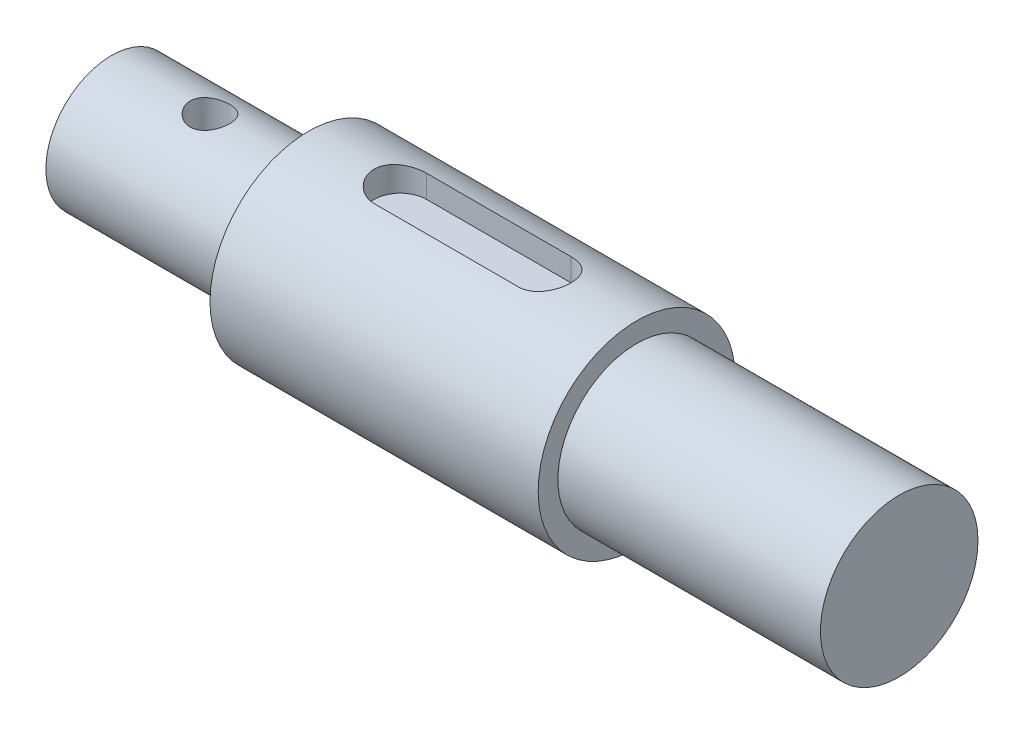
ISO-10303-21;
HEADER;
FILE_DESCRIPTION(('STEP AP214'),'2;1');
FILE_NAME('part.step','',(''),(''),'','','');
FILE_SCHEMA(('AUTOMOTIVE_DESIGN { 1 0 10303 214 1 1 1 1 }'));
ENDSEC;
DATA;
#1=APPLICATION_CONTEXT('core data for automotive mechanical design processes');
#2=APPLICATION_PROTOCOL_DEFINITION('international standard','automotive_design',2000,#1);
#3=PRODUCT_CONTEXT('',#1,'mechanical');
#4=PRODUCT('Part','Part','',(#3));
#5=PRODUCT_RELATED_PRODUCT_CATEGORY('part','',(#4));
#6=PRODUCT_DEFINITION_FORMATION('','',#4);
#7=PRODUCT_DEFINITION_CONTEXT('part definition',#1,'design');
#8=PRODUCT_DEFINITION('design','',#6,#7);
#9=PRODUCT_DEFINITION_SHAPE('','',#8);
#10=(LENGTH_UNIT() NAMED_UNIT(*) SI_UNIT(.MILLI.,.METRE.));
#11=(NAMED_UNIT(*) PLANE_ANGLE_UNIT() SI_UNIT($,.RADIAN.));
#12=(NAMED_UNIT(*) SI_UNIT($,.STERADIAN.) SOLID_ANGLE_UNIT());
#13=UNCERTAINTY_MEASURE_WITH_UNIT(LENGTH_MEASURE(1.E-05),#10,'distance_accuracy_value','');
#14=(GEOMETRIC_REPRESENTATION_CONTEXT(3) GLOBAL_UNCERTAINTY_ASSIGNED_CONTEXT((#13)) GLOBAL_UNIT_ASSIGNED_CONTEXT((#10,
#11,#12)) REPRESENTATION_CONTEXT('',''));
#15=CARTESIAN_POINT('',(0.,0.,0.));
#16=DIRECTION('',(0.,0.,1.));
#17=DIRECTION('',(1.,0.,0.));
#18=AXIS2_PLACEMENT_3D('',#15,#16,#17);
#19=CARTESIAN_POINT('',(30.,0.,0.));
#20=DIRECTION('',(-1.,0.,0.));
#21=DIRECTION('',(0.,0.,1.));
#22=AXIS2_PLACEMENT_3D('',#19,#20,#21);
#23=CYLINDRICAL_SURFACE('',#22,10.);
#24=CARTESIAN_POINT('',(15.,-9.53939201416946,3.));
#25=CARTESIAN_POINT('',(15.1643890958848,-9.5393937145396,2.99999795267528));
#26=CARTESIAN_POINT('',(15.328798448288,-9.54368780418137,2.98644216334284));
#27=CARTESIAN_POINT('',(15.6528104991839,-9.56033156605799,2.93271688893498));
#28=CARTESIAN_POINT('',(15.8124115730029,-9.57268392986936,2.89253851147156));
#29=CARTESIAN_POINT('',(16.1220694565435,-9.60392204971265,2.78705506539911));
#30=CARTESIAN_POINT('',(16.2721416592662,-9.62279693406465,2.72179178788487));
#31=CARTESIAN_POINT('',(16.5592438679906,-9.66493865095134,2.56812843835858));
#32=CARTESIAN_POINT('',(16.6962719173689,-9.68820614082039,2.47972490274105));
#33=CARTESIAN_POINT('',(16.9577327811547,-9.73733724371531,2.27929508283254));
#34=CARTESIAN_POINT('',(17.0816917958926,-9.76325616623271,2.16666414351613));
#35=CARTESIAN_POINT('',(17.309275902645,-9.81429723873514,1.9222724751592));
#36=CARTESIAN_POINT('',(17.4128983808998,-9.8394192859541,1.79050929092223));
#37=CARTESIAN_POINT('',(17.5989253996666,-9.88666429158777,1.50822287558738));
#38=CARTESIAN_POINT('',(17.6808468488856,-9.90871448684808,1.35736804267163));
#39=CARTESIAN_POINT('',(17.8179745180855,-9.94668871841369,1.04324929073871));
#40=CARTESIAN_POINT('',(17.8731864997149,-9.96261407578992,0.879988056775824));
#41=CARTESIAN_POINT('',(17.953760002181,-9.98615292007178,0.55064770526166));
#42=CARTESIAN_POINT('',(17.9799302553054,-9.99399114738673,0.384782797907604));
#43=CARTESIAN_POINT('',(18.0042346492929,-10.001264030027,0.0508436474986294));
#44=CARTESIAN_POINT('',(18.0023746788039,-10.0007004504217,-0.117230124100742));
#45=CARTESIAN_POINT('',(17.971214262914,-9.99139207635305,-0.445142313200313));
#46=CARTESIAN_POINT('',(17.9427896123803,-9.98290840410475,-0.605072535282659));
#47=CARTESIAN_POINT('',(17.8607373280114,-9.95903044225231,-0.917778426885074));
#48=CARTESIAN_POINT('',(17.8071080981145,-9.9436357150134,-1.07055364264577));
#49=CARTESIAN_POINT('',(17.675575953163,-9.90730441973756,-1.36669465270247));
#50=CARTESIAN_POINT('',(17.5973975943861,-9.88630539352772,-1.50993012938864));
#51=CARTESIAN_POINT('',(17.419204295143,-9.84099281296778,-1.78152934756663));
#52=CARTESIAN_POINT('',(17.3191841740708,-9.81667847277943,-1.90988954974544));
#53=CARTESIAN_POINT('',(17.0956044984991,-9.76623100973852,-2.15332096305837));
#54=CARTESIAN_POINT('',(16.9712861619492,-9.74006390633503,-2.26768916079755));
#55=CARTESIAN_POINT('',(16.7049799642112,-9.68967959784414,-2.47415303080114));
#56=CARTESIAN_POINT('',(16.562990349189,-9.66546258669242,-2.56624648967452));
#57=CARTESIAN_POINT('',(16.2635210615278,-9.62155806359712,-2.72627990669511));
#58=CARTESIAN_POINT('',(16.1059059083825,-9.60191621258491,-2.79397978469377));
#59=CARTESIAN_POINT('',(15.7807855832214,-9.5699278496379,-2.90166725750739));
#60=CARTESIAN_POINT('',(15.6132836569649,-9.55757895796639,-2.94166389279494));
#61=CARTESIAN_POINT('',(15.2798352784976,-9.54209699116239,-2.99149540565762));
#62=CARTESIAN_POINT('',(15.1140635522056,-9.53863757349918,-3.00239892760807));
#63=CARTESIAN_POINT('',(14.7830541999867,-9.54042384874813,-2.99671894465741));
#64=CARTESIAN_POINT('',(14.61781650254,-9.54566832310787,-2.98013928742559));
#65=CARTESIAN_POINT('',(14.2970232440566,-9.56395117112153,-2.92091527148479));
#66=CARTESIAN_POINT('',(14.1413276714725,-9.57678353015602,-2.87895922862587));
#67=CARTESIAN_POINT('',(13.8391966183706,-9.6085828246183,-2.77097155495853));
#68=CARTESIAN_POINT('',(13.692762571719,-9.62755070717977,-2.70493620685512));
#69=CARTESIAN_POINT('',(13.4089650718556,-9.67011670046268,-2.54863742393008));
#70=CARTESIAN_POINT('',(13.2719505580284,-9.69382542139644,-2.4577712834546));
#71=CARTESIAN_POINT('',(13.0147237876384,-9.74296411293928,-2.25510603200767));
#72=CARTESIAN_POINT('',(12.8945155647744,-9.76839449459994,-2.14330191069793));
#73=CARTESIAN_POINT('',(12.6696391883705,-9.81927267096329,-1.8969102649872));
#74=CARTESIAN_POINT('',(12.565728742026,-9.84468490126011,-1.76162213171487));
#75=CARTESIAN_POINT('',(12.3820665979445,-9.89169703497298,-1.4749235691805));
#76=CARTESIAN_POINT('',(12.3023137004371,-9.91329712769433,-1.32351394108789));
#77=CARTESIAN_POINT('',(12.1699999388634,-9.95011940949915,-1.00987100941044));
#78=CARTESIAN_POINT('',(12.1172359676821,-9.96538906849931,-0.847729244075679));
#79=CARTESIAN_POINT('',(12.0398781622192,-9.98803959193653,-0.516339933009177));
#80=CARTESIAN_POINT('',(12.0152762681032,-9.9954227134176,-0.347094434709527));
#81=CARTESIAN_POINT('',(11.995553911891,-10.001330881628,-0.0133043077654876));
#82=CARTESIAN_POINT('',(11.9993346091843,-10.0001861022264,0.151170358172411));
#83=CARTESIAN_POINT('',(12.0336432649982,-9.98994528930073,0.477038962328806));
#84=CARTESIAN_POINT('',(12.0641697069609,-9.98084970660925,0.638433074693055));
#85=CARTESIAN_POINT('',(12.1504233227993,-9.95582336716653,0.951871626082715));
#86=CARTESIAN_POINT('',(12.205876361298,-9.93996705801732,1.10399785470278));
#87=CARTESIAN_POINT('',(12.3401638290144,-9.903058860789,1.3968664755041));
#88=CARTESIAN_POINT('',(12.4190021005724,-9.88200611899893,1.53760699210116));
#89=CARTESIAN_POINT('',(12.6007469148601,-9.83607931656457,1.80860378484113));
#90=CARTESIAN_POINT('',(12.7043428600015,-9.81110453847119,1.93838050015353));
#91=CARTESIAN_POINT('',(12.9314207766656,-9.76047074424668,2.17907514269189));
#92=CARTESIAN_POINT('',(13.0549084757963,-9.73481153282158,2.28998761920387));
#93=CARTESIAN_POINT('',(13.322681556621,-9.68481361262638,2.49312538789097));
#94=CARTESIAN_POINT('',(13.4674771067809,-9.66053705386971,2.58469519515913));
#95=CARTESIAN_POINT('',(13.771110348322,-9.61705095017586,2.74208627057551));
#96=CARTESIAN_POINT('',(13.9299412472024,-9.59783897193911,2.80791991114577));
#97=CARTESIAN_POINT('',(14.2394808632125,-9.56855633435189,2.90603885065899));
#98=CARTESIAN_POINT('',(14.389217293862,-9.5577230968104,2.94117718022463));
#99=CARTESIAN_POINT('',(14.6926304449915,-9.54314085194333,2.98815637670288));
#100=CARTESIAN_POINT('',(14.8463063692905,-9.53939042442861,3.00000191412191));
#101=CARTESIAN_POINT('',(15.,-9.53939201416946,3.));
#102=B_SPLINE_CURVE_WITH_KNOTS('',3,(#24,#25,#26,#27,#28,#29,#30,#31,#32,#33,#34,#35,#36,#37,
#38,#39,#40,#41,#42,#43,#44,#45,#46,#47,#48,#49,#50,#51,#52,#53,#54,#55,#56,#57,#58,#59,#60,#61,
#62,#63,#64,#65,#66,#67,#68,#69,#70,#71,#72,#73,#74,#75,#76,#77,#78,#79,#80,#81,#82,#83,#84,#85,
#86,#87,#88,#89,#90,#91,#92,#93,#94,#95,#96,#97,#98,#99,#100,#101),.UNSPECIFIED.,.T.,.F.,(4,2,2,
2,2,2,2,2,2,2,2,2,2,2,2,2,2,2,2,2,2,2,2,2,2,2,2,2,2,2,2,2,2,2,2,2,2,2,4),(0.,0.492600331831084,
0.985365283377997,1.47731282893239,1.9693340507402,2.47546300015967,2.98165695742545,
3.49831878547288,4.01486911175754,4.51664280299115,5.0183110820288,5.5040025198176,
5.98972471780752,6.48110418671352,6.9726003318166,7.48304294046555,7.99353624983725,
8.50892476494933,9.02414501262032,9.52016161585828,10.0161087821998,10.4991718988284,
10.9823096209678,11.4784146362399,11.9746385186305,12.4895901220641,13.0045161465361,
13.5155078363386,14.0263532464857,14.5175260782765,15.0086710610072,15.4945419374965,
15.9804926898797,16.4819925411419,16.9836370526499,17.500232793435,18.016579879331,
18.477223077201,18.9377739007233),.UNSPECIFIED.);
#103=CARTESIAN_POINT('',(15.,-9.53939201416946,3.));
#104=VERTEX_POINT('',#103);
#105=EDGE_CURVE('E56',#104,#104,#102,.T.);
#106=ORIENTED_EDGE('',*,*,#105,.T.);
#107=EDGE_LOOP('',(#106));
#108=FACE_BOUND('',#107,.T.);
#109=CARTESIAN_POINT('',(15.,9.53939201416946,3.));
#110=CARTESIAN_POINT('',(14.8356109041152,9.5393937145396,2.99999795267528));
#111=CARTESIAN_POINT('',(14.671201551712,9.54368780418137,2.98644216334284));
#112=CARTESIAN_POINT('',(14.3471895008161,9.56033156605799,2.93271688893498));
#113=CARTESIAN_POINT('',(14.1875884269971,9.57268392986936,2.89253851147156));
#114=CARTESIAN_POINT('',(13.8779305434565,9.60392204971265,2.7870550653991));
#115=CARTESIAN_POINT('',(13.7278583407338,9.62279693406465,2.72179178788487));
#116=CARTESIAN_POINT('',(13.4407561320094,9.66493865095134,2.56812843835858));
#117=CARTESIAN_POINT('',(13.3037280826311,9.68820614082039,2.47972490274105));
#118=CARTESIAN_POINT('',(13.0422672188452,9.73733724371531,2.27929508283254));
#119=CARTESIAN_POINT('',(12.9183082041074,9.76325616623271,2.16666414351613));
#120=CARTESIAN_POINT('',(12.690724097355,9.81429723873514,1.9222724751592));
#121=CARTESIAN_POINT('',(12.5871016191002,9.8394192859541,1.79050929092222));
#122=CARTESIAN_POINT('',(12.4010746003334,9.88666429158777,1.50822287558738));
#123=CARTESIAN_POINT('',(12.3191531511144,9.90871448684808,1.35736804267163));
#124=CARTESIAN_POINT('',(12.1820254819145,9.94668871841369,1.04324929073871));
#125=CARTESIAN_POINT('',(12.1268135002851,9.96261407578992,0.879988056775822));
#126=CARTESIAN_POINT('',(12.046239997819,9.98615292007178,0.550647705261659));
#127=CARTESIAN_POINT('',(12.0200697446946,9.99399114738673,0.384782797907603));
#128=CARTESIAN_POINT('',(11.9957653507071,10.001264030027,0.050843647498628));
#129=CARTESIAN_POINT('',(11.9976253211961,10.0007004504217,-0.117230124100743));
#130=CARTESIAN_POINT('',(12.028785737086,9.99139207635305,-0.445142313200314));
#131=CARTESIAN_POINT('',(12.0572103876197,9.98290840410475,-0.60507253528266));
#132=CARTESIAN_POINT('',(12.1392626719886,9.95903044225231,-0.917778426885075));
#133=CARTESIAN_POINT('',(12.1928919018855,9.9436357150134,-1.07055364264578));
#134=CARTESIAN_POINT('',(12.324424046837,9.90730441973756,-1.36669465270248));
#135=CARTESIAN_POINT('',(12.4026024056139,9.88630539352772,-1.50993012938864));
#136=CARTESIAN_POINT('',(12.580795704857,9.84099281296778,-1.78152934756663));
#137=CARTESIAN_POINT('',(12.6808158259292,9.81667847277943,-1.90988954974545));
#138=CARTESIAN_POINT('',(12.9043955015009,9.76623100973852,-2.15332096305837));
#139=CARTESIAN_POINT('',(13.0287138380508,9.74006390633503,-2.26768916079755));
#140=CARTESIAN_POINT('',(13.2950200357888,9.68967959784414,-2.47415303080115));
#141=CARTESIAN_POINT('',(13.437009650811,9.66546258669242,-2.56624648967452));
#142=CARTESIAN_POINT('',(13.7364789384722,9.62155806359712,-2.72627990669511));
#143=CARTESIAN_POINT('',(13.8940940916175,9.6019162125849,-2.79397978469377));
#144=CARTESIAN_POINT('',(14.2192144167786,9.5699278496379,-2.90166725750739));
#145=CARTESIAN_POINT('',(14.3867163430351,9.55757895796639,-2.94166389279494));
#146=CARTESIAN_POINT('',(14.7201647215024,9.54209699116239,-2.99149540565762));
#147=CARTESIAN_POINT('',(14.8859364477944,9.53863757349918,-3.00239892760807));
#148=CARTESIAN_POINT('',(15.2169458000133,9.54042384874813,-2.99671894465741));
#149=CARTESIAN_POINT('',(15.38218349746,9.54566832310787,-2.98013928742559));
#150=CARTESIAN_POINT('',(15.7029767559434,9.56395117112153,-2.92091527148479));
#151=CARTESIAN_POINT('',(15.8586723285275,9.57678353015602,-2.87895922862587));
#152=CARTESIAN_POINT('',(16.1608033816294,9.6085828246183,-2.77097155495853));
#153=CARTESIAN_POINT('',(16.307237428281,9.62755070717977,-2.70493620685512));
#154=CARTESIAN_POINT('',(16.5910349281444,9.67011670046268,-2.54863742393008));
#155=CARTESIAN_POINT('',(16.7280494419716,9.69382542139644,-2.4577712834546));
#156=CARTESIAN_POINT('',(16.9852762123616,9.74296411293928,-2.25510603200767));
#157=CARTESIAN_POINT('',(17.1054844352256,9.76839449459994,-2.14330191069793));
#158=CARTESIAN_POINT('',(17.3303608116295,9.81927267096329,-1.8969102649872));
#159=CARTESIAN_POINT('',(17.434271257974,9.84468490126011,-1.76162213171487));
#160=CARTESIAN_POINT('',(17.6179334020555,9.89169703497298,-1.4749235691805));
#161=CARTESIAN_POINT('',(17.6976862995629,9.91329712769433,-1.32351394108789));
#162=CARTESIAN_POINT('',(17.8300000611366,9.95011940949915,-1.00987100941045));
#163=CARTESIAN_POINT('',(17.882764032318,9.96538906849931,-0.847729244075679));
#164=CARTESIAN_POINT('',(17.9601218377808,9.98803959193653,-0.516339933009177));
#165=CARTESIAN_POINT('',(17.9847237318968,9.9954227134176,-0.347094434709526));
#166=CARTESIAN_POINT('',(18.004446088109,10.001330881628,-0.0133043077654864));
#167=CARTESIAN_POINT('',(18.0006653908157,10.0001861022264,0.151170358172413));
#168=CARTESIAN_POINT('',(17.9663567350018,9.98994528930073,0.477038962328807));
#169=CARTESIAN_POINT('',(17.9358302930391,9.98084970660925,0.638433074693057));
#170=CARTESIAN_POINT('',(17.8495766772007,9.95582336716653,0.951871626082715));
#171=CARTESIAN_POINT('',(17.794123638702,9.93996705801732,1.10399785470278));
#172=CARTESIAN_POINT('',(17.6598361709856,9.903058860789,1.3968664755041));
#173=CARTESIAN_POINT('',(17.5809978994276,9.88200611899893,1.53760699210116));
#174=CARTESIAN_POINT('',(17.3992530851399,9.83607931656457,1.80860378484113));
#175=CARTESIAN_POINT('',(17.2956571399985,9.81110453847119,1.93838050015353));
#176=CARTESIAN_POINT('',(17.0685792233344,9.76047074424668,2.17907514269189));
#177=CARTESIAN_POINT('',(16.9450915242037,9.73481153282158,2.28998761920387));
#178=CARTESIAN_POINT('',(16.677318443379,9.68481361262638,2.49312538789097));
#179=CARTESIAN_POINT('',(16.5325228932191,9.66053705386971,2.58469519515913));
#180=CARTESIAN_POINT('',(16.228889651678,9.61705095017586,2.74208627057551));
#181=CARTESIAN_POINT('',(16.0700587527976,9.59783897193911,2.80791991114577));
#182=CARTESIAN_POINT('',(15.7605191367875,9.56855633435189,2.90603885065899));
#183=CARTESIAN_POINT('',(15.610782706138,9.5577230968104,2.94117718022463));
#184=CARTESIAN_POINT('',(15.3073695550085,9.54314085194333,2.98815637670288));
#185=CARTESIAN_POINT('',(15.1536936307095,9.53939042442861,3.00000191412191));
#186=CARTESIAN_POINT('',(15.,9.53939201416946,3.));
#187=B_SPLINE_CURVE_WITH_KNOTS('',3,(#109,#110,#111,#112,#113,#114,#115,#116,#117,#118,#119,
#120,#121,#122,#123,#124,#125,#126,#127,#128,#129,#130,#131,#132,#133,#134,#135,#136,#137,#138,
#139,#140,#141,#142,#143,#144,#145,#146,#147,#148,#149,#150,#151,#152,#153,#154,#155,#156,#157,
#158,#159,#160,#161,#162,#163,#164,#165,#166,#167,#168,#169,#170,#171,#172,#173,#174,#175,#176,
#177,#178,#179,#180,#181,#182,#183,#184,#185,#186),.UNSPECIFIED.,.T.,.F.,(4,2,2,2,2,2,2,2,2,2,2,
2,2,2,2,2,2,2,2,2,2,2,2,2,2,2,2,2,2,2,2,2,2,2,2,2,2,2,4),(0.,0.492600331831085,
0.985365283377999,1.47731282893239,1.9693340507402,2.47546300015968,2.98165695742545,
3.49831878547289,4.01486911175754,4.51664280299115,5.0183110820288,5.5040025198176,
5.98972471780752,6.48110418671352,6.9726003318166,7.48304294046555,7.99353624983725,
8.50892476494933,9.02414501262032,9.52016161585828,10.0161087821998,10.4991718988284,
10.9823096209678,11.4784146362399,11.9746385186305,12.4895901220641,13.0045161465361,
13.5155078363386,14.0263532464857,14.5175260782765,15.0086710610072,15.4945419374965,
15.9804926898797,16.4819925411419,16.9836370526499,17.500232793435,18.016579879331,
18.477223077201,18.9377739007233),.UNSPECIFIED.);
#188=CARTESIAN_POINT('',(15.,9.53939201416946,3.));
#189=VERTEX_POINT('',#188);
#190=EDGE_CURVE('E127',#189,#189,#187,.T.);
#191=ORIENTED_EDGE('',*,*,#190,.T.);
#192=EDGE_LOOP('',(#191));
#193=FACE_BOUND('',#192,.T.);
#194=CARTESIAN_POINT('',(30.,0.,0.));
#195=DIRECTION('',(1.,0.,0.));
#196=DIRECTION('',(0.,0.,-1.));
#197=AXIS2_PLACEMENT_3D('',#194,#195,#196);
#198=CIRCLE('',#197,10.);
#199=CARTESIAN_POINT('',(30.,0.,-10.));
#200=VERTEX_POINT('',#199);
#201=EDGE_CURVE('E150',#200,#200,#198,.T.);
#202=ORIENTED_EDGE('',*,*,#201,.F.);
#203=EDGE_LOOP('',(#202));
#204=FACE_BOUND('',#203,.T.);
#205=CARTESIAN_POINT('',(0.,0.,0.));
#206=DIRECTION('',(1.,0.,0.));
#207=DIRECTION('',(0.,0.,-1.));
#208=AXIS2_PLACEMENT_3D('',#205,#206,#207);
#209=CIRCLE('',#208,10.);
#210=CARTESIAN_POINT('',(0.,0.,-10.));
#211=VERTEX_POINT('',#210);
#212=EDGE_CURVE('E155',#211,#211,#209,.T.);
#213=ORIENTED_EDGE('',*,*,#212,.T.);
#214=EDGE_LOOP('',(#213));
#215=FACE_BOUND('',#214,.T.);
#216=ADVANCED_FACE('F51',(#108,#193,#204,#215),#23,.T.);
#217=CARTESIAN_POINT('',(0.,0.,0.));
#218=DIRECTION('',(1.,0.,0.));
#219=DIRECTION('',(0.,0.,-1.));
#220=AXIS2_PLACEMENT_3D('',#217,#218,#219);
#221=PLANE('',#220);
#222=ORIENTED_EDGE('',*,*,#212,.F.);
#223=EDGE_LOOP('',(#222));
#224=FACE_BOUND('',#223,.T.);
#225=ADVANCED_FACE('F222',(#224),#221,.F.);
#226=CARTESIAN_POINT('',(80.,0.,0.));
#227=DIRECTION('',(-1.,0.,0.));
#228=DIRECTION('',(0.,0.,1.));
#229=AXIS2_PLACEMENT_3D('',#226,#227,#228);
#230=CYLINDRICAL_SURFACE('',#229,15.);
#231=DIRECTION('',(-1.,0.,0.));
#232=VECTOR('',#231,1.);
#233=CARTESIAN_POINT('',(80.,14.456832294801,-4.));
#234=LINE('',#233,#232);
#235=CARTESIAN_POINT('',(44.,14.456832294801,-4.));
#236=VERTEX_POINT('',#235);
#237=CARTESIAN_POINT('',(66.,14.456832294801,-4.));
#238=VERTEX_POINT('',#237);
#239=EDGE_CURVE('E11',#236,#238,#234,.F.);
#240=ORIENTED_EDGE('',*,*,#239,.T.);
#241=CARTESIAN_POINT('',(66.,14.456832294801,-4.));
#242=CARTESIAN_POINT('',(66.1103582434041,14.4568189842467,-4.00001309389174));
#243=CARTESIAN_POINT('',(66.2207085219929,14.4580956467717,-3.99543311151603));
#244=CARTESIAN_POINT('',(66.4405786539661,14.4631301353517,-3.97718874589725));
#245=CARTESIAN_POINT('',(66.5500986577597,14.4668875005959,-3.96352604983924));
#246=CARTESIAN_POINT('',(66.767301653514,14.4767740441058,-3.92725695741263));
#247=CARTESIAN_POINT('',(66.8749880878483,14.482898107258,-3.90466984692446));
#248=CARTESIAN_POINT('',(67.0879748603556,14.4973231400467,-3.85076543838185));
#249=CARTESIAN_POINT('',(67.1932751565853,14.5056241479174,-3.81944798699437));
#250=CARTESIAN_POINT('',(67.5044634187753,14.5334412456827,-3.71275643853686));
#251=CARTESIAN_POINT('',(67.7058749335474,14.5558829598252,-3.62460332607936));
#252=CARTESIAN_POINT('',(68.0910207596257,14.6060171290377,-3.4169578047582));
#253=CARTESIAN_POINT('',(68.2747492039724,14.6337113178035,-3.29745504324307));
#254=CARTESIAN_POINT('',(68.6239705769278,14.6920016406366,-3.0273032087801));
#255=CARTESIAN_POINT('',(68.7889618409657,14.7226489452442,-2.87601544465619));
#256=CARTESIAN_POINT('',(69.0915575669617,14.7829523618628,-2.54795832924028));
#257=CARTESIAN_POINT('',(69.2291575828684,14.8126083123117,-2.37118484921248));
#258=CARTESIAN_POINT('',(69.4751721301854,14.8681604116921,-1.99367199592155));
#259=CARTESIAN_POINT('',(69.5830839655783,14.8939887414057,-1.79259414843396));
#260=CARTESIAN_POINT('',(69.7633728889613,14.9383834129136,-1.3743557555279));
#261=CARTESIAN_POINT('',(69.8357576447769,14.9569513215518,-1.15719869214846));
#262=CARTESIAN_POINT('',(69.9413098251693,14.9843709217852,-0.718234307369669));
#263=CARTESIAN_POINT('',(69.9753372128936,14.9934353394137,-0.496647293428103));
#264=CARTESIAN_POINT('',(70.005914313223,15.0015705103632,-0.0507319917605735));
#265=CARTESIAN_POINT('',(70.0024694841925,15.0006427191926,0.17359589196346));
#266=CARTESIAN_POINT('',(69.9588043136319,14.9890534931376,0.612629502642178));
#267=CARTESIAN_POINT('',(69.9195138723437,14.9786381919443,0.827435206418332));
#268=CARTESIAN_POINT('',(69.8067748491367,14.9495347795912,1.24728467665106));
#269=CARTESIAN_POINT('',(69.7333246478493,14.9308462762364,1.45232797980576));
#270=CARTESIAN_POINT('',(69.5536400337472,14.8869312076945,1.84920963545356));
#271=CARTESIAN_POINT('',(69.4470866277702,14.8616414267933,2.04089626466618));
#272=CARTESIAN_POINT('',(69.2044572310353,14.8072486052897,2.40398441957149));
#273=CARTESIAN_POINT('',(69.0683760778169,14.7781448982353,2.57538239000351));
#274=CARTESIAN_POINT('',(68.7656720288986,14.7182294237973,2.89854935036781));
#275=CARTESIAN_POINT('',(68.5982419921057,14.6873926412643,3.04955722400809));
#276=CARTESIAN_POINT('',(68.2399571592908,14.6282716207252,3.32161448391783));
#277=CARTESIAN_POINT('',(68.0490959035188,14.5999880903709,3.4426555807802));
#278=CARTESIAN_POINT('',(67.7486467166354,14.5618587427771,3.59932937334133));
#279=CARTESIAN_POINT('',(67.645711084959,14.5498268172621,3.64754371945348));
#280=CARTESIAN_POINT('',(67.4359536787286,14.5275984074125,3.73509417643326));
#281=CARTESIAN_POINT('',(67.3291334875373,14.5174011851057,3.77443385857863));
#282=CARTESIAN_POINT('',(67.1124805807798,14.4991713081511,3.843867838105));
#283=CARTESIAN_POINT('',(67.0026511218071,14.4911364080612,3.87397173088603));
#284=CARTESIAN_POINT('',(66.7807247788751,14.4774747012191,3.92471856960774));
#285=CARTESIAN_POINT('',(66.66862897718,14.4718467722231,3.9453659249532));
#286=CARTESIAN_POINT('',(66.463748975282,14.4639761334309,3.97411378733403));
#287=CARTESIAN_POINT('',(66.3712035538327,14.4613012625133,3.98382319960777));
#288=CARTESIAN_POINT('',(66.1857746466901,14.4577275048596,3.99676420153356));
#289=CARTESIAN_POINT('',(66.0928919295675,14.4568258092259,4.00000603663184));
#290=CARTESIAN_POINT('',(66.,14.456832294801,4.));
#291=B_SPLINE_CURVE_WITH_KNOTS('',3,(#241,#242,#243,#244,#245,#246,#247,#248,#249,#250,#251,
#252,#253,#254,#255,#256,#257,#258,#259,#260,#261,#262,#263,#264,#265,#266,#267,#268,#269,#270,
#271,#272,#273,#274,#275,#276,#277,#278,#279,#280,#281,#282,#283,#284,#285,#286,#287,#288,#289,
#290),.UNSPECIFIED.,.F.,.F.,(4,2,2,2,2,2,2,2,2,2,2,2,2,2,2,2,2,2,2,2,2,2,2,2,4),(0.,
0.330958670878051,0.66185588076851,0.992041890688552,1.32223370010826,1.98190700187179,
2.64179842357631,3.3164963753615,3.99130375261119,4.67691814590524,5.36238449759351,
6.03215661862343,6.7018311790669,7.35461236515046,8.00742449996359,8.66673340793704,
9.32615767867958,10.0057598785669,10.6855498604333,11.0281077435251,11.3705275300852,
11.7125903499581,12.0544935096115,12.3335333037377,12.6121307120356),.UNSPECIFIED.);
#292=CARTESIAN_POINT('',(66.,14.456832294801,4.));
#293=VERTEX_POINT('',#292);
#294=EDGE_CURVE('E149',#238,#293,#291,.T.);
#295=ORIENTED_EDGE('',*,*,#294,.T.);
#296=DIRECTION('',(-1.,0.,0.));
#297=VECTOR('',#296,1.);
#298=CARTESIAN_POINT('',(80.,14.456832294801,4.));
#299=LINE('',#298,#297);
#300=CARTESIAN_POINT('',(44.,14.456832294801,4.));
#301=VERTEX_POINT('',#300);
#302=EDGE_CURVE('E66',#293,#301,#299,.T.);
#303=ORIENTED_EDGE('',*,*,#302,.T.);
#304=CARTESIAN_POINT('',(44.,14.456832294801,4.));
#305=CARTESIAN_POINT('',(43.8896417565959,14.4568189842467,4.00001309389174));
#306=CARTESIAN_POINT('',(43.7792914780071,14.4580956467717,3.99543311151603));
#307=CARTESIAN_POINT('',(43.5594213460339,14.4631301353517,3.97718874589725));
#308=CARTESIAN_POINT('',(43.4499013422403,14.4668875005959,3.96352604983924));
#309=CARTESIAN_POINT('',(43.232698346486,14.4767740441058,3.92725695741262));
#310=CARTESIAN_POINT('',(43.1250119121517,14.482898107258,3.90466984692446));
#311=CARTESIAN_POINT('',(42.9120251396444,14.4973231400467,3.85076543838184));
#312=CARTESIAN_POINT('',(42.8067248434147,14.5056241479174,3.81944798699437));
#313=CARTESIAN_POINT('',(42.4955365812247,14.5334412456827,3.71275643853686));
#314=CARTESIAN_POINT('',(42.2941250664526,14.5558829598252,3.62460332607935));
#315=CARTESIAN_POINT('',(41.9089792403742,14.6060171290377,3.4169578047582));
#316=CARTESIAN_POINT('',(41.7252507960276,14.6337113178035,3.29745504324306));
#317=CARTESIAN_POINT('',(41.3760294230722,14.6920016406366,3.0273032087801));
#318=CARTESIAN_POINT('',(41.2110381590343,14.7226489452442,2.87601544465619));
#319=CARTESIAN_POINT('',(40.9084424330384,14.7829523618628,2.54795832924029));
#320=CARTESIAN_POINT('',(40.7708424171316,14.8126083123117,2.37118484921249));
#321=CARTESIAN_POINT('',(40.5248278698145,14.8681604116921,1.99367199592156));
#322=CARTESIAN_POINT('',(40.4169160344217,14.8939887414057,1.79259414843396));
#323=CARTESIAN_POINT('',(40.2366271110387,14.9383834129136,1.37435575552791));
#324=CARTESIAN_POINT('',(40.1642423552231,14.9569513215518,1.15719869214847));
#325=CARTESIAN_POINT('',(40.0586901748307,14.9843709217852,0.718234307369676));
#326=CARTESIAN_POINT('',(40.0246627871064,14.9934353394137,0.496647293428111));
#327=CARTESIAN_POINT('',(39.994085686777,15.0015705103632,0.0507319917605805));
#328=CARTESIAN_POINT('',(39.9975305158075,15.0006427191926,-0.173595891963453));
#329=CARTESIAN_POINT('',(40.0411956863681,14.9890534931376,-0.61262950264217));
#330=CARTESIAN_POINT('',(40.0804861276563,14.9786381919443,-0.827435206418324));
#331=CARTESIAN_POINT('',(40.1932251508632,14.9495347795912,-1.24728467665105));
#332=CARTESIAN_POINT('',(40.2666753521507,14.9308462762364,-1.45232797980575));
#333=CARTESIAN_POINT('',(40.4463599662528,14.8869312076945,-1.84920963545355));
#334=CARTESIAN_POINT('',(40.5529133722298,14.8616414267933,-2.04089626466617));
#335=CARTESIAN_POINT('',(40.7955427689646,14.8072486052897,-2.40398441957148));
#336=CARTESIAN_POINT('',(40.9316239221831,14.7781448982353,-2.57538239000351));
#337=CARTESIAN_POINT('',(41.2343279711014,14.7182294237973,-2.8985493503678));
#338=CARTESIAN_POINT('',(41.4017580078943,14.6873926412643,-3.04955722400808));
#339=CARTESIAN_POINT('',(41.7600428407092,14.6282716207252,-3.32161448391783));
#340=CARTESIAN_POINT('',(41.9509040964811,14.5999880903709,-3.4426555807802));
#341=CARTESIAN_POINT('',(42.2513532833646,14.5618587427771,-3.59932937334133));
#342=CARTESIAN_POINT('',(42.354288915041,14.5498268172621,-3.64754371945348));
#343=CARTESIAN_POINT('',(42.5640463212715,14.5275984074125,-3.73509417643326));
#344=CARTESIAN_POINT('',(42.6708665124627,14.5174011851057,-3.77443385857864));
#345=CARTESIAN_POINT('',(42.8875194192202,14.4991713081511,-3.843867838105));
#346=CARTESIAN_POINT('',(42.9973488781929,14.4911364080612,-3.87397173088603));
#347=CARTESIAN_POINT('',(43.2192752211249,14.4774747012191,-3.92471856960774));
#348=CARTESIAN_POINT('',(43.33137102282,14.4718467722231,-3.9453659249532));
#349=CARTESIAN_POINT('',(43.536251024718,14.4639761334309,-3.97411378733403));
#350=CARTESIAN_POINT('',(43.6287964461673,14.4613012625133,-3.98382319960777));
#351=CARTESIAN_POINT('',(43.8142253533099,14.4577275048596,-3.99676420153356));
#352=CARTESIAN_POINT('',(43.9071080704325,14.4568258092259,-4.00000603663184));
#353=CARTESIAN_POINT('',(44.,14.456832294801,-4.));
#354=B_SPLINE_CURVE_WITH_KNOTS('',3,(#304,#305,#306,#307,#308,#309,#310,#311,#312,#313,#314,
#315,#316,#317,#318,#319,#320,#321,#322,#323,#324,#325,#326,#327,#328,#329,#330,#331,#332,#333,
#334,#335,#336,#337,#338,#339,#340,#341,#342,#343,#344,#345,#346,#347,#348,#349,#350,#351,#352,
#353),.UNSPECIFIED.,.F.,.F.,(4,2,2,2,2,2,2,2,2,2,2,2,2,2,2,2,2,2,2,2,2,2,2,2,4),(0.,
0.330958670878051,0.661855880768517,0.992041890688581,1.32223370010825,1.98190700187181,
2.64179842357632,3.31649637536149,3.99130375261118,4.67691814590523,5.3623844975935,
6.03215661862343,6.7018311790669,7.35461236515045,8.00742449996358,8.66673340793703,
9.32615767867957,10.0057598785669,10.6855498604333,11.0281077435251,11.3705275300852,
11.7125903499581,12.0544935096114,12.3335333037377,12.6121307120356),.UNSPECIFIED.);
#355=EDGE_CURVE('E74',#301,#236,#354,.T.);
#356=ORIENTED_EDGE('',*,*,#355,.T.);
#357=EDGE_LOOP('',(#240,#295,#303,#356));
#358=FACE_BOUND('',#357,.T.);
#359=CARTESIAN_POINT('',(80.,0.,0.));
#360=DIRECTION('',(1.,0.,0.));
#361=DIRECTION('',(0.,0.,-1.));
#362=AXIS2_PLACEMENT_3D('',#359,#360,#361);
#363=CIRCLE('',#362,15.);
#364=CARTESIAN_POINT('',(80.,0.,-15.));
#365=VERTEX_POINT('',#364);
#366=EDGE_CURVE('E151',#365,#365,#363,.T.);
#367=ORIENTED_EDGE('',*,*,#366,.F.);
#368=EDGE_LOOP('',(#367));
#369=FACE_BOUND('',#368,.T.);
#370=CARTESIAN_POINT('',(30.,0.,0.));
#371=DIRECTION('',(1.,0.,0.));
#372=DIRECTION('',(0.,0.,-1.));
#373=AXIS2_PLACEMENT_3D('',#370,#371,#372);
#374=CIRCLE('',#373,15.);
#375=CARTESIAN_POINT('',(30.,0.,-15.));
#376=VERTEX_POINT('',#375);
#377=EDGE_CURVE('E144',#376,#376,#374,.T.);
#378=ORIENTED_EDGE('',*,*,#377,.T.);
#379=EDGE_LOOP('',(#378));
#380=FACE_BOUND('',#379,.T.);
#381=ADVANCED_FACE('F181',(#358,#369,#380),#230,.T.);
#382=CARTESIAN_POINT('',(80.,0.,0.));
#383=DIRECTION('',(1.,0.,0.));
#384=DIRECTION('',(0.,0.,-1.));
#385=AXIS2_PLACEMENT_3D('',#382,#383,#384);
#386=PLANE('',#385);
#387=CARTESIAN_POINT('',(80.,0.,0.));
#388=DIRECTION('',(1.,0.,0.));
#389=DIRECTION('',(0.,0.,-1.));
#390=AXIS2_PLACEMENT_3D('',#387,#388,#389);
#391=CIRCLE('',#390,12.);
#392=CARTESIAN_POINT('',(80.,0.,-12.));
#393=VERTEX_POINT('',#392);
#394=EDGE_CURVE('E145',#393,#393,#391,.T.);
#395=ORIENTED_EDGE('',*,*,#394,.F.);
#396=EDGE_LOOP('',(#395));
#397=FACE_BOUND('',#396,.T.);
#398=ORIENTED_EDGE('',*,*,#366,.T.);
#399=EDGE_LOOP('',(#398));
#400=FACE_BOUND('',#399,.T.);
#401=ADVANCED_FACE('F214',(#397,#400),#386,.T.);
#402=CARTESIAN_POINT('',(30.,0.,0.));
#403=DIRECTION('',(1.,0.,0.));
#404=DIRECTION('',(0.,0.,-1.));
#405=AXIS2_PLACEMENT_3D('',#402,#403,#404);
#406=PLANE('',#405);
#407=ORIENTED_EDGE('',*,*,#201,.T.);
#408=EDGE_LOOP('',(#407));
#409=FACE_BOUND('',#408,.T.);
#410=ORIENTED_EDGE('',*,*,#377,.F.);
#411=EDGE_LOOP('',(#410));
#412=FACE_BOUND('',#411,.T.);
#413=ADVANCED_FACE('F211',(#409,#412),#406,.F.);
#414=CARTESIAN_POINT('',(120.,0.,0.));
#415=DIRECTION('',(-1.,0.,0.));
#416=DIRECTION('',(0.,0.,1.));
#417=AXIS2_PLACEMENT_3D('',#414,#415,#416);
#418=CYLINDRICAL_SURFACE('',#417,12.);
#419=CARTESIAN_POINT('',(120.,0.,0.));
#420=DIRECTION('',(1.,0.,0.));
#421=DIRECTION('',(0.,0.,-1.));
#422=AXIS2_PLACEMENT_3D('',#419,#420,#421);
#423=CIRCLE('',#422,12.);
#424=CARTESIAN_POINT('',(120.,0.,-12.));
#425=VERTEX_POINT('',#424);
#426=EDGE_CURVE('E136',#425,#425,#423,.T.);
#427=ORIENTED_EDGE('',*,*,#426,.F.);
#428=EDGE_LOOP('',(#427));
#429=FACE_BOUND('',#428,.T.);
#430=ORIENTED_EDGE('',*,*,#394,.T.);
#431=EDGE_LOOP('',(#430));
#432=FACE_BOUND('',#431,.T.);
#433=ADVANCED_FACE('F206',(#429,#432),#418,.T.);
#434=CARTESIAN_POINT('',(120.,0.,0.));
#435=DIRECTION('',(1.,0.,0.));
#436=DIRECTION('',(0.,0.,-1.));
#437=AXIS2_PLACEMENT_3D('',#434,#435,#436);
#438=PLANE('',#437);
#439=ORIENTED_EDGE('',*,*,#426,.T.);
#440=EDGE_LOOP('',(#439));
#441=FACE_BOUND('',#440,.T.);
#442=ADVANCED_FACE('F202',(#441),#438,.T.);
#443=CARTESIAN_POINT('',(44.,11.,0.));
#444=DIRECTION('',(0.,1.,0.));
#445=DIRECTION('',(0.,0.,1.));
#446=AXIS2_PLACEMENT_3D('',#443,#444,#445);
#447=CYLINDRICAL_SURFACE('',#446,4.);
#448=DIRECTION('',(0.,1.,0.));
#449=VECTOR('',#448,1.);
#450=CARTESIAN_POINT('',(44.,11.,4.));
#451=LINE('',#450,#449);
#452=CARTESIAN_POINT('',(44.,11.,4.));
#453=VERTEX_POINT('',#452);
#454=EDGE_CURVE('E97',#453,#301,#451,.T.);
#455=ORIENTED_EDGE('',*,*,#454,.F.);
#456=CARTESIAN_POINT('',(44.,11.,0.));
#457=DIRECTION('',(0.,1.,0.));
#458=DIRECTION('',(0.,0.,-1.));
#459=AXIS2_PLACEMENT_3D('',#456,#457,#458);
#460=CIRCLE('',#459,4.);
#461=CARTESIAN_POINT('',(44.,11.,-4.));
#462=VERTEX_POINT('',#461);
#463=EDGE_CURVE('E101',#462,#453,#460,.T.);
#464=ORIENTED_EDGE('',*,*,#463,.F.);
#465=DIRECTION('',(0.,1.,0.));
#466=VECTOR('',#465,1.);
#467=CARTESIAN_POINT('',(44.,11.,-4.));
#468=LINE('',#467,#466);
#469=EDGE_CURVE('E133',#462,#236,#468,.T.);
#470=ORIENTED_EDGE('',*,*,#469,.T.);
#471=ORIENTED_EDGE('',*,*,#355,.F.);
#472=EDGE_LOOP('',(#455,#464,#470,#471));
#473=FACE_BOUND('',#472,.T.);
#474=ADVANCED_FACE('F99',(#473),#447,.F.);
#475=CARTESIAN_POINT('',(44.,11.,-4.));
#476=DIRECTION('',(0.,0.,-1.));
#477=DIRECTION('',(-1.,0.,0.));
#478=AXIS2_PLACEMENT_3D('',#475,#476,#477);
#479=PLANE('',#478);
#480=ORIENTED_EDGE('',*,*,#469,.F.);
#481=DIRECTION('',(-1.,0.,0.));
#482=VECTOR('',#481,1.);
#483=CARTESIAN_POINT('',(44.,11.,-4.));
#484=LINE('',#483,#482);
#485=CARTESIAN_POINT('',(66.,11.,-4.));
#486=VERTEX_POINT('',#485);
#487=EDGE_CURVE('E107',#486,#462,#484,.T.);
#488=ORIENTED_EDGE('',*,*,#487,.F.);
#489=DIRECTION('',(0.,1.,0.));
#490=VECTOR('',#489,1.);
#491=CARTESIAN_POINT('',(66.,11.,-4.));
#492=LINE('',#491,#490);
#493=EDGE_CURVE('E137',#486,#238,#492,.T.);
#494=ORIENTED_EDGE('',*,*,#493,.T.);
#495=ORIENTED_EDGE('',*,*,#239,.F.);
#496=EDGE_LOOP('',(#480,#488,#494,#495));
#497=FACE_BOUND('',#496,.T.);
#498=ADVANCED_FACE('F192',(#497),#479,.F.);
#499=CARTESIAN_POINT('',(66.,11.,0.));
#500=DIRECTION('',(0.,1.,0.));
#501=DIRECTION('',(0.,0.,1.));
#502=AXIS2_PLACEMENT_3D('',#499,#500,#501);
#503=CYLINDRICAL_SURFACE('',#502,4.);
#504=ORIENTED_EDGE('',*,*,#493,.F.);
#505=CARTESIAN_POINT('',(66.,11.,0.));
#506=DIRECTION('',(0.,1.,0.));
#507=DIRECTION('',(0.,0.,-1.));
#508=AXIS2_PLACEMENT_3D('',#505,#506,#507);
#509=CIRCLE('',#508,4.);
#510=CARTESIAN_POINT('',(66.,11.,4.));
#511=VERTEX_POINT('',#510);
#512=EDGE_CURVE('E117',#511,#486,#509,.T.);
#513=ORIENTED_EDGE('',*,*,#512,.F.);
#514=DIRECTION('',(0.,1.,0.));
#515=VECTOR('',#514,1.);
#516=CARTESIAN_POINT('',(66.,11.,4.));
#517=LINE('',#516,#515);
#518=EDGE_CURVE('E106',#511,#293,#517,.T.);
#519=ORIENTED_EDGE('',*,*,#518,.T.);
#520=ORIENTED_EDGE('',*,*,#294,.F.);
#521=EDGE_LOOP('',(#504,#513,#519,#520));
#522=FACE_BOUND('',#521,.T.);
#523=ADVANCED_FACE('F185',(#522),#503,.F.);
#524=CARTESIAN_POINT('',(66.,11.,4.));
#525=DIRECTION('',(0.,0.,1.));
#526=DIRECTION('',(1.,0.,0.));
#527=AXIS2_PLACEMENT_3D('',#524,#525,#526);
#528=PLANE('',#527);
#529=ORIENTED_EDGE('',*,*,#518,.F.);
#530=DIRECTION('',(1.,0.,0.));
#531=VECTOR('',#530,1.);
#532=CARTESIAN_POINT('',(66.,11.,4.));
#533=LINE('',#532,#531);
#534=EDGE_CURVE('E110',#453,#511,#533,.T.);
#535=ORIENTED_EDGE('',*,*,#534,.F.);
#536=ORIENTED_EDGE('',*,*,#454,.T.);
#537=ORIENTED_EDGE('',*,*,#302,.F.);
#538=EDGE_LOOP('',(#529,#535,#536,#537));
#539=FACE_BOUND('',#538,.T.);
#540=ADVANCED_FACE('F111',(#539),#528,.F.);
#541=CARTESIAN_POINT('',(44.,11.,0.));
#542=DIRECTION('',(0.,-1.,0.));
#543=DIRECTION('',(0.,0.,-1.));
#544=AXIS2_PLACEMENT_3D('',#541,#542,#543);
#545=PLANE('',#544);
#546=ORIENTED_EDGE('',*,*,#463,.T.);
#547=ORIENTED_EDGE('',*,*,#534,.T.);
#548=ORIENTED_EDGE('',*,*,#512,.T.);
#549=ORIENTED_EDGE('',*,*,#487,.T.);
#550=EDGE_LOOP('',(#546,#547,#548,#549));
#551=FACE_BOUND('',#550,.T.);
#552=ADVANCED_FACE('F119',(#551),#545,.F.);
#553=CARTESIAN_POINT('',(15.,-121.,0.));
#554=DIRECTION('',(0.,1.,0.));
#555=DIRECTION('',(0.,0.,1.));
#556=AXIS2_PLACEMENT_3D('',#553,#554,#555);
#557=CYLINDRICAL_SURFACE('',#556,3.);
#558=ORIENTED_EDGE('',*,*,#190,.F.);
#559=EDGE_LOOP('',(#558));
#560=FACE_BOUND('',#559,.T.);
#561=ORIENTED_EDGE('',*,*,#105,.F.);
#562=EDGE_LOOP('',(#561));
#563=FACE_BOUND('',#562,.T.);
#564=ADVANCED_FACE('F240',(#560,#563),#557,.F.);
#565=CLOSED_SHELL('',(#216,#225,#381,#401,#413,#433,#442,#474,#498,#523,#540,#552,#564));
#566=MANIFOLD_SOLID_BREP('B2',#565);
#567=ADVANCED_BREP_SHAPE_REPRESENTATION('',(#18,#566),#14);
#568=SHAPE_DEFINITION_REPRESENTATION(#9,#567);
ENDSEC;
END-ISO-10303-21;
